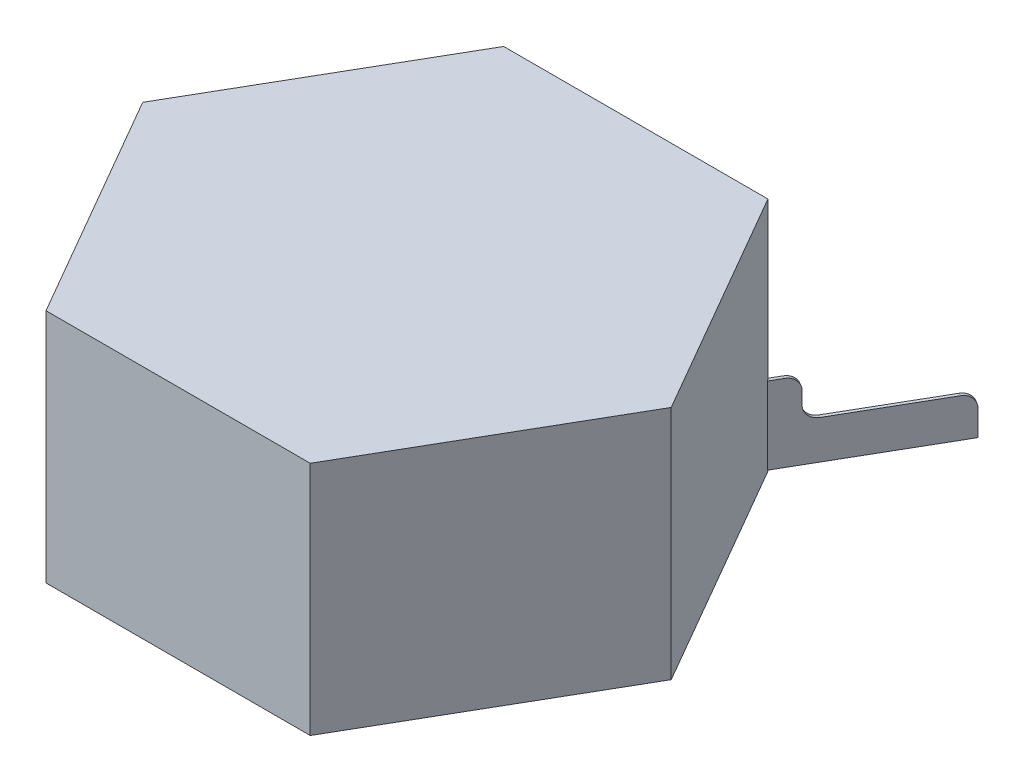
ISO-10303-21;
HEADER;
FILE_DESCRIPTION(('STEP AP214'),'2;1');
FILE_NAME('part.step','',(''),(''),'','','');
FILE_SCHEMA(('AUTOMOTIVE_DESIGN { 1 0 10303 214 1 1 1 1 }'));
ENDSEC;
DATA;
#1=APPLICATION_CONTEXT('core data for automotive mechanical design processes');
#2=APPLICATION_PROTOCOL_DEFINITION('international standard','automotive_design',2000,#1);
#3=PRODUCT_CONTEXT('',#1,'mechanical');
#4=PRODUCT('Part','Part','',(#3));
#5=PRODUCT_RELATED_PRODUCT_CATEGORY('part','',(#4));
#6=PRODUCT_DEFINITION_FORMATION('','',#4);
#7=PRODUCT_DEFINITION_CONTEXT('part definition',#1,'design');
#8=PRODUCT_DEFINITION('design','',#6,#7);
#9=PRODUCT_DEFINITION_SHAPE('','',#8);
#10=(LENGTH_UNIT() NAMED_UNIT(*) SI_UNIT(.MILLI.,.METRE.));
#11=(NAMED_UNIT(*) PLANE_ANGLE_UNIT() SI_UNIT($,.RADIAN.));
#12=(NAMED_UNIT(*) SI_UNIT($,.STERADIAN.) SOLID_ANGLE_UNIT());
#13=UNCERTAINTY_MEASURE_WITH_UNIT(LENGTH_MEASURE(1.E-05),#10,'distance_accuracy_value','');
#14=(GEOMETRIC_REPRESENTATION_CONTEXT(3) GLOBAL_UNCERTAINTY_ASSIGNED_CONTEXT((#13)) GLOBAL_UNIT_ASSIGNED_CONTEXT((#10,
#11,#12)) REPRESENTATION_CONTEXT('',''));
#15=CARTESIAN_POINT('',(0.,0.,0.));
#16=DIRECTION('',(0.,0.,1.));
#17=DIRECTION('',(1.,0.,0.));
#18=AXIS2_PLACEMENT_3D('',#15,#16,#17);
#19=CARTESIAN_POINT('',(3331.73389653825,3694.9589015043,-4489.43788317152));
#20=DIRECTION('',(-0.866025403784429,0.,-0.500000000000017));
#21=DIRECTION('',(-0.500000000000017,0.,0.866025403784429));
#22=AXIS2_PLACEMENT_3D('',#19,#20,#21);
#23=PLANE('',#22);
#24=DIRECTION('',(0.500000000000017,0.,-0.866025403784429));
#25=VECTOR('',#24,1.);
#26=CARTESIAN_POINT('',(3331.73389653825,936.624999999999,-4489.43788317152));
#27=LINE('',#26,#25);
#28=CARTESIAN_POINT('',(2810.4577868055,936.624999999999,-3586.5611763426));
#29=VERTEX_POINT('',#28);
#30=CARTESIAN_POINT('',(3331.73389653825,936.625,-4489.43788317152));
#31=VERTEX_POINT('',#30);
#32=EDGE_CURVE('E694',#29,#31,#27,.T.);
#33=ORIENTED_EDGE('',*,*,#32,.F.);
#34=DIRECTION('',(0.,-1.,0.));
#35=VECTOR('',#34,1.);
#36=CARTESIAN_POINT('',(2810.4577868055,3694.9589015043,-3586.5611763426));
#37=LINE('',#36,#35);
#38=CARTESIAN_POINT('',(2810.4577868055,6.35,-3586.5611763426));
#39=VERTEX_POINT('',#38);
#40=EDGE_CURVE('E368',#29,#39,#37,.T.);
#41=ORIENTED_EDGE('',*,*,#40,.T.);
#42=DIRECTION('',(0.500000000000017,0.,-0.866025403784429));
#43=VECTOR('',#42,1.);
#44=CARTESIAN_POINT('',(3331.73389653825,6.35,-4489.43788317152));
#45=LINE('',#44,#43);
#46=CARTESIAN_POINT('',(3331.73389653825,6.35,-4489.43788317152));
#47=VERTEX_POINT('',#46);
#48=EDGE_CURVE('E370',#39,#47,#45,.T.);
#49=ORIENTED_EDGE('',*,*,#48,.T.);
#50=DIRECTION('',(0.,-1.,0.));
#51=VECTOR('',#50,1.);
#52=CARTESIAN_POINT('',(3331.73389653825,3694.9589015043,-4489.43788317152));
#53=LINE('',#52,#51);
#54=EDGE_CURVE('E352',#31,#47,#53,.T.);
#55=ORIENTED_EDGE('',*,*,#54,.F.);
#56=EDGE_LOOP('',(#33,#41,#49,#55));
#57=FACE_BOUND('',#56,.T.);
#58=ADVANCED_FACE('F33',(#57),#23,.F.);
#59=CARTESIAN_POINT('',(2810.45778680547,3694.9589015043,-5392.31459000051));
#60=DIRECTION('',(-0.866025403784429,0.,0.500000000000017));
#61=DIRECTION('',(0.500000000000017,0.,0.866025403784429));
#62=AXIS2_PLACEMENT_3D('',#59,#60,#61);
#63=PLANE('',#62);
#64=DIRECTION('',(0.,-1.,0.));
#65=VECTOR('',#64,1.);
#66=CARTESIAN_POINT('',(2814.12396101472,3694.9589015043,-5385.96459000068));
#67=LINE('',#66,#65);
#68=CARTESIAN_POINT('',(2814.12396101472,319.778379999999,-5385.96459000068));
#69=VERTEX_POINT('',#68);
#70=CARTESIAN_POINT('',(2814.12396101472,14.9783799999996,-5385.96459000068));
#71=VERTEX_POINT('',#70);
#72=EDGE_CURVE('E340',#69,#71,#67,.T.);
#73=ORIENTED_EDGE('',*,*,#72,.F.);
#74=DIRECTION('',(-0.500000000000017,0.,-0.866025403784429));
#75=VECTOR('',#74,1.);
#76=CARTESIAN_POINT('',(2810.45778680547,319.778379999999,-5392.3145900005));
#77=LINE('',#76,#75);
#78=CARTESIAN_POINT('',(2810.45778680547,319.778379999999,-5392.31459000051));
#79=VERTEX_POINT('',#78);
#80=EDGE_CURVE('E279',#69,#79,#77,.T.);
#81=ORIENTED_EDGE('',*,*,#80,.T.);
#82=DIRECTION('',(0.,-1.,0.));
#83=VECTOR('',#82,1.);
#84=CARTESIAN_POINT('',(2810.45778680547,3694.9589015043,-5392.31459000051));
#85=LINE('',#84,#83);
#86=CARTESIAN_POINT('',(2810.45778680547,936.624999999999,-5392.31459000051));
#87=VERTEX_POINT('',#86);
#88=EDGE_CURVE('E348',#87,#79,#85,.T.);
#89=ORIENTED_EDGE('',*,*,#88,.F.);
#90=DIRECTION('',(-0.500000000000017,0.,-0.866025403784429));
#91=VECTOR('',#90,1.);
#92=CARTESIAN_POINT('',(2810.45778680547,936.625,-5392.31459000051));
#93=LINE('',#92,#91);
#94=EDGE_CURVE('E696',#31,#87,#93,.T.);
#95=ORIENTED_EDGE('',*,*,#94,.F.);
#96=ORIENTED_EDGE('',*,*,#54,.T.);
#97=DIRECTION('',(-0.500000000000017,0.,-0.866025403784429));
#98=VECTOR('',#97,1.);
#99=CARTESIAN_POINT('',(2810.45778680547,6.35,-5392.31459000051));
#100=LINE('',#99,#98);
#101=CARTESIAN_POINT('',(2810.45778680547,6.35,-5392.31459000051));
#102=VERTEX_POINT('',#101);
#103=EDGE_CURVE('E344',#47,#102,#100,.T.);
#104=ORIENTED_EDGE('',*,*,#103,.T.);
#105=CARTESIAN_POINT('',(2810.45778680547,14.9783799999997,-5392.31459000051));
#106=VERTEX_POINT('',#105);
#107=EDGE_CURVE('E342',#106,#102,#85,.T.);
#108=ORIENTED_EDGE('',*,*,#107,.F.);
#109=DIRECTION('',(0.500000000000017,0.,0.866025403784429));
#110=VECTOR('',#109,1.);
#111=CARTESIAN_POINT('',(2810.45778680547,14.9783799999996,-5392.31459000051));
#112=LINE('',#111,#110);
#113=EDGE_CURVE('E276',#106,#71,#112,.T.);
#114=ORIENTED_EDGE('',*,*,#113,.T.);
#115=EDGE_LOOP('',(#73,#81,#89,#95,#96,#104,#108,#114));
#116=FACE_BOUND('',#115,.T.);
#117=ADVANCED_FACE('F338',(#116),#63,.F.);
#118=CARTESIAN_POINT('',(1767.90556733976,3694.9589015043,-5392.31459000051));
#119=DIRECTION('',(0.,0.,1.));
#120=DIRECTION('',(1.,0.,0.));
#121=AXIS2_PLACEMENT_3D('',#118,#119,#120);
#122=PLANE('',#121);
#123=DIRECTION('',(0.,-1.,0.));
#124=VECTOR('',#123,1.);
#125=CARTESIAN_POINT('',(1775.2379157586,3694.9589015043,-5392.31459000051));
#126=LINE('',#125,#124);
#127=CARTESIAN_POINT('',(1775.2379157586,319.778379999999,-5392.31459000051));
#128=VERTEX_POINT('',#127);
#129=CARTESIAN_POINT('',(1775.2379157586,14.9783799999991,-5392.31459000051));
#130=VERTEX_POINT('',#129);
#131=EDGE_CURVE('E11',#128,#130,#126,.T.);
#132=ORIENTED_EDGE('',*,*,#131,.F.);
#133=DIRECTION('',(-1.,0.,0.));
#134=VECTOR('',#133,1.);
#135=CARTESIAN_POINT('',(1767.90556733976,319.778379999999,-5392.31459000051));
#136=LINE('',#135,#134);
#137=CARTESIAN_POINT('',(1767.90556733976,319.778379999999,-5392.31459000051));
#138=VERTEX_POINT('',#137);
#139=EDGE_CURVE('E260',#128,#138,#136,.T.);
#140=ORIENTED_EDGE('',*,*,#139,.T.);
#141=DIRECTION('',(0.,-1.,0.));
#142=VECTOR('',#141,1.);
#143=CARTESIAN_POINT('',(1767.90556733976,3694.9589015043,-5392.31459000051));
#144=LINE('',#143,#142);
#145=CARTESIAN_POINT('',(1767.90556733976,936.624999999999,-5392.31459000051));
#146=VERTEX_POINT('',#145);
#147=EDGE_CURVE('E357',#146,#138,#144,.T.);
#148=ORIENTED_EDGE('',*,*,#147,.F.);
#149=DIRECTION('',(-1.,0.,0.));
#150=VECTOR('',#149,1.);
#151=CARTESIAN_POINT('',(1767.90556733976,936.624999999999,-5392.31459000051));
#152=LINE('',#151,#150);
#153=EDGE_CURVE('E701',#87,#146,#152,.T.);
#154=ORIENTED_EDGE('',*,*,#153,.F.);
#155=ORIENTED_EDGE('',*,*,#88,.T.);
#156=DIRECTION('',(-1.,0.,0.));
#157=VECTOR('',#156,1.);
#158=CARTESIAN_POINT('',(1767.90556733975,319.77838,-5392.31459000051));
#159=LINE('',#158,#157);
#160=CARTESIAN_POINT('',(2803.12543838656,319.77838,-5392.31459000051));
#161=VERTEX_POINT('',#160);
#162=EDGE_CURVE('E377',#79,#161,#159,.T.);
#163=ORIENTED_EDGE('',*,*,#162,.T.);
#164=DIRECTION('',(0.,-1.,0.));
#165=VECTOR('',#164,1.);
#166=CARTESIAN_POINT('',(2803.12543838656,3694.9589015043,-5392.31459000051));
#167=LINE('',#166,#165);
#168=CARTESIAN_POINT('',(2803.12543838656,14.9783799999996,-5392.31459000051));
#169=VERTEX_POINT('',#168);
#170=EDGE_CURVE('E371',#161,#169,#167,.T.);
#171=ORIENTED_EDGE('',*,*,#170,.T.);
#172=DIRECTION('',(1.,0.,0.));
#173=VECTOR('',#172,1.);
#174=CARTESIAN_POINT('',(1767.90556733976,14.9783799999992,-5392.31459000051));
#175=LINE('',#174,#173);
#176=EDGE_CURVE('E374',#169,#106,#175,.T.);
#177=ORIENTED_EDGE('',*,*,#176,.T.);
#178=ORIENTED_EDGE('',*,*,#107,.T.);
#179=DIRECTION('',(-1.,0.,0.));
#180=VECTOR('',#179,1.);
#181=CARTESIAN_POINT('',(1767.90556733976,6.35,-5392.31459000051));
#182=LINE('',#181,#180);
#183=CARTESIAN_POINT('',(1767.90556733976,6.35,-5392.31459000051));
#184=VERTEX_POINT('',#183);
#185=EDGE_CURVE('E351',#102,#184,#182,.T.);
#186=ORIENTED_EDGE('',*,*,#185,.T.);
#187=CARTESIAN_POINT('',(1767.90556733976,14.9783799999989,-5392.31459000051));
#188=VERTEX_POINT('',#187);
#189=EDGE_CURVE('E361',#188,#184,#144,.T.);
#190=ORIENTED_EDGE('',*,*,#189,.F.);
#191=DIRECTION('',(1.,0.,0.));
#192=VECTOR('',#191,1.);
#193=CARTESIAN_POINT('',(1767.90556733976,14.9783799999992,-5392.31459000051));
#194=LINE('',#193,#192);
#195=EDGE_CURVE('E258',#188,#130,#194,.T.);
#196=ORIENTED_EDGE('',*,*,#195,.T.);
#197=EDGE_LOOP('',(#132,#140,#148,#154,#155,#163,#171,#177,#178,#186,#190,#196));
#198=FACE_BOUND('',#197,.T.);
#199=ADVANCED_FACE('F396',(#198),#122,.F.);
#200=CARTESIAN_POINT('',(1246.62945760701,3694.9589015043,-4489.43788317159));
#201=DIRECTION('',(0.866025403784429,0.,0.500000000000017));
#202=DIRECTION('',(0.500000000000017,0.,-0.866025403784429));
#203=AXIS2_PLACEMENT_3D('',#200,#201,#202);
#204=PLANE('',#203);
#205=ORIENTED_EDGE('',*,*,#147,.T.);
#206=DIRECTION('',(-0.500000000000017,0.,0.866025403784429));
#207=VECTOR('',#206,1.);
#208=CARTESIAN_POINT('',(1246.62945760701,319.778379999998,-4489.43788317159));
#209=LINE('',#208,#207);
#210=CARTESIAN_POINT('',(1764.23939313047,319.778379999999,-5385.96459000063));
#211=VERTEX_POINT('',#210);
#212=EDGE_CURVE('E41',#138,#211,#209,.T.);
#213=ORIENTED_EDGE('',*,*,#212,.T.);
#214=DIRECTION('',(0.,-1.,0.));
#215=VECTOR('',#214,1.);
#216=CARTESIAN_POINT('',(1764.23939313047,3694.9589015043,-5385.96459000062));
#217=LINE('',#216,#215);
#218=CARTESIAN_POINT('',(1764.23939313047,14.9783799999992,-5385.96459000063));
#219=VERTEX_POINT('',#218);
#220=EDGE_CURVE('E381',#211,#219,#217,.T.);
#221=ORIENTED_EDGE('',*,*,#220,.T.);
#222=DIRECTION('',(0.500000000000017,0.,-0.866025403784429));
#223=VECTOR('',#222,1.);
#224=CARTESIAN_POINT('',(1246.62945760701,14.9783799999983,-4489.43788317159));
#225=LINE('',#224,#223);
#226=EDGE_CURVE('E384',#219,#188,#225,.T.);
#227=ORIENTED_EDGE('',*,*,#226,.T.);
#228=ORIENTED_EDGE('',*,*,#189,.T.);
#229=DIRECTION('',(-0.500000000000017,0.,0.866025403784429));
#230=VECTOR('',#229,1.);
#231=CARTESIAN_POINT('',(1246.62945760701,6.35,-4489.43788317159));
#232=LINE('',#231,#230);
#233=CARTESIAN_POINT('',(1246.62945760701,6.35,-4489.43788317159));
#234=VERTEX_POINT('',#233);
#235=EDGE_CURVE('E360',#184,#234,#232,.T.);
#236=ORIENTED_EDGE('',*,*,#235,.T.);
#237=DIRECTION('',(0.,-1.,0.));
#238=VECTOR('',#237,1.);
#239=CARTESIAN_POINT('',(1246.62945760701,3694.9589015043,-4489.43788317159));
#240=LINE('',#239,#238);
#241=CARTESIAN_POINT('',(1246.62945760701,936.624999999998,-4489.43788317159));
#242=VERTEX_POINT('',#241);
#243=EDGE_CURVE('E362',#242,#234,#240,.T.);
#244=ORIENTED_EDGE('',*,*,#243,.F.);
#245=DIRECTION('',(-0.500000000000017,0.,0.866025403784429));
#246=VECTOR('',#245,1.);
#247=CARTESIAN_POINT('',(1246.62945760701,936.624999999999,-4489.43788317159));
#248=LINE('',#247,#246);
#249=EDGE_CURVE('E703',#146,#242,#248,.T.);
#250=ORIENTED_EDGE('',*,*,#249,.F.);
#251=EDGE_LOOP('',(#205,#213,#221,#227,#228,#236,#244,#250));
#252=FACE_BOUND('',#251,.T.);
#253=ADVANCED_FACE('F388',(#252),#204,.F.);
#254=CARTESIAN_POINT('',(1767.90556733979,3694.9589015043,-3586.5611763426));
#255=DIRECTION('',(0.866025403784429,0.,-0.500000000000016));
#256=DIRECTION('',(-0.500000000000017,0.,-0.866025403784429));
#257=AXIS2_PLACEMENT_3D('',#254,#255,#256);
#258=PLANE('',#257);
#259=DIRECTION('',(0.500000000000017,0.,0.866025403784429));
#260=VECTOR('',#259,1.);
#261=CARTESIAN_POINT('',(1767.90556733979,936.624999999998,-3586.5611763426));
#262=LINE('',#261,#260);
#263=CARTESIAN_POINT('',(1767.90556733979,936.624999999998,-3586.5611763426));
#264=VERTEX_POINT('',#263);
#265=EDGE_CURVE('E375',#242,#264,#262,.T.);
#266=ORIENTED_EDGE('',*,*,#265,.F.);
#267=ORIENTED_EDGE('',*,*,#243,.T.);
#268=DIRECTION('',(0.500000000000016,0.,0.866025403784429));
#269=VECTOR('',#268,1.);
#270=CARTESIAN_POINT('',(1767.90556733979,6.35,-3586.5611763426));
#271=LINE('',#270,#269);
#272=CARTESIAN_POINT('',(1767.90556733979,6.35,-3586.5611763426));
#273=VERTEX_POINT('',#272);
#274=EDGE_CURVE('E364',#234,#273,#271,.T.);
#275=ORIENTED_EDGE('',*,*,#274,.T.);
#276=DIRECTION('',(0.,-1.,0.));
#277=VECTOR('',#276,1.);
#278=CARTESIAN_POINT('',(1767.90556733979,3694.9589015043,-3586.5611763426));
#279=LINE('',#278,#277);
#280=EDGE_CURVE('E365',#264,#273,#279,.T.);
#281=ORIENTED_EDGE('',*,*,#280,.F.);
#282=EDGE_LOOP('',(#266,#267,#275,#281));
#283=FACE_BOUND('',#282,.T.);
#284=ADVANCED_FACE('F464',(#283),#258,.F.);
#285=CARTESIAN_POINT('',(1767.90556733979,3694.9589015043,-3586.5611763426));
#286=DIRECTION('',(0.,0.,-1.));
#287=DIRECTION('',(-1.,0.,0.));
#288=AXIS2_PLACEMENT_3D('',#285,#286,#287);
#289=PLANE('',#288);
#290=DIRECTION('',(1.,0.,0.));
#291=VECTOR('',#290,1.);
#292=CARTESIAN_POINT('',(1767.9055673398,936.624999999998,-3586.5611763426));
#293=LINE('',#292,#291);
#294=EDGE_CURVE('E692',#264,#29,#293,.T.);
#295=ORIENTED_EDGE('',*,*,#294,.F.);
#296=ORIENTED_EDGE('',*,*,#280,.T.);
#297=DIRECTION('',(1.,0.,0.));
#298=VECTOR('',#297,1.);
#299=CARTESIAN_POINT('',(1767.90556733979,6.35,-3586.5611763426));
#300=LINE('',#299,#298);
#301=EDGE_CURVE('E367',#273,#39,#300,.T.);
#302=ORIENTED_EDGE('',*,*,#301,.T.);
#303=ORIENTED_EDGE('',*,*,#40,.F.);
#304=EDGE_LOOP('',(#295,#296,#302,#303));
#305=FACE_BOUND('',#304,.T.);
#306=ADVANCED_FACE('F467',(#305),#289,.F.);
#307=CARTESIAN_POINT('',(0.,6.35,0.));
#308=DIRECTION('',(0.,1.,0.));
#309=DIRECTION('',(0.,0.,1.));
#310=AXIS2_PLACEMENT_3D('',#307,#308,#309);
#311=PLANE('',#310);
#312=ORIENTED_EDGE('',*,*,#48,.F.);
#313=ORIENTED_EDGE('',*,*,#301,.F.);
#314=ORIENTED_EDGE('',*,*,#274,.F.);
#315=ORIENTED_EDGE('',*,*,#235,.F.);
#316=ORIENTED_EDGE('',*,*,#185,.F.);
#317=ORIENTED_EDGE('',*,*,#103,.F.);
#318=EDGE_LOOP('',(#312,#313,#314,#315,#316,#317));
#319=FACE_BOUND('',#318,.T.);
#320=ADVANCED_FACE('F471',(#319),#311,.F.);
#321=CARTESIAN_POINT('',(2289.18167707263,936.624999999999,-4489.43730000051));
#322=DIRECTION('',(0.,1.,0.));
#323=DIRECTION('',(0.,0.,-1.));
#324=AXIS2_PLACEMENT_3D('',#321,#322,#323);
#325=PLANE('',#324);
#326=ORIENTED_EDGE('',*,*,#294,.T.);
#327=ORIENTED_EDGE('',*,*,#32,.T.);
#328=ORIENTED_EDGE('',*,*,#94,.T.);
#329=ORIENTED_EDGE('',*,*,#153,.T.);
#330=ORIENTED_EDGE('',*,*,#249,.T.);
#331=ORIENTED_EDGE('',*,*,#265,.T.);
#332=EDGE_LOOP('',(#326,#327,#328,#329,#330,#331));
#333=FACE_BOUND('',#332,.T.);
#334=ADVANCED_FACE('F35',(#333),#325,.T.);
#335=CARTESIAN_POINT('',(2813.6664383866,14.9783799999995,-5385.17213756316));
#336=DIRECTION('',(-0.866025403784429,0.,-0.500000000000017));
#337=DIRECTION('',(-0.500000000000017,0.,0.866025403784429));
#338=AXIS2_PLACEMENT_3D('',#335,#336,#337);
#339=PLANE('',#338);
#340=DIRECTION('',(-0.500000000000017,0.,0.866025403784429));
#341=VECTOR('',#340,1.);
#342=CARTESIAN_POINT('',(2813.6664383866,319.77838,-5385.17213756316));
#343=LINE('',#342,#341);
#344=CARTESIAN_POINT('',(2839.0664383866,319.77838,-5429.16622807541));
#345=VERTEX_POINT('',#344);
#346=EDGE_CURVE('E280',#69,#345,#343,.F.);
#347=ORIENTED_EDGE('',*,*,#346,.F.);
#348=ORIENTED_EDGE('',*,*,#72,.T.);
#349=DIRECTION('',(-0.500000000000017,0.,0.866025403784429));
#350=VECTOR('',#349,1.);
#351=CARTESIAN_POINT('',(2813.6664383866,14.9783799999995,-5385.17213756316));
#352=LINE('',#351,#350);
#353=CARTESIAN_POINT('',(3118.46643838661,14.9783799999999,-5913.10122371015));
#354=VERTEX_POINT('',#353);
#355=EDGE_CURVE('E289',#354,#71,#352,.T.);
#356=ORIENTED_EDGE('',*,*,#355,.F.);
#357=DIRECTION('',(0.,1.,0.));
#358=VECTOR('',#357,1.);
#359=CARTESIAN_POINT('',(3118.46643838661,14.9783799999999,-5913.10122371015));
#360=LINE('',#359,#358);
#361=CARTESIAN_POINT('',(3118.46643838661,116.57838,-5913.10122371015));
#362=VERTEX_POINT('',#361);
#363=EDGE_CURVE('E268',#362,#354,#360,.F.);
#364=ORIENTED_EDGE('',*,*,#363,.F.);
#365=CARTESIAN_POINT('',(3093.06643838661,116.57838,-5869.1071331979));
#366=DIRECTION('',(0.866025403784429,0.,0.500000000000017));
#367=DIRECTION('',(0.500000000000017,0.,-0.866025403784429));
#368=AXIS2_PLACEMENT_3D('',#365,#366,#367);
#369=CIRCLE('',#368,50.8);
#370=CARTESIAN_POINT('',(3093.06643838661,167.37838,-5869.1071331979));
#371=VERTEX_POINT('',#370);
#372=EDGE_CURVE('E267',#371,#362,#369,.F.);
#373=ORIENTED_EDGE('',*,*,#372,.F.);
#374=DIRECTION('',(-0.500000000000017,0.,0.866025403784429));
#375=VECTOR('',#374,1.);
#376=CARTESIAN_POINT('',(2813.6664383866,167.37838,-5385.17213756316));
#377=LINE('',#376,#375);
#378=CARTESIAN_POINT('',(2889.86643838661,167.37838,-5517.15440909991));
#379=VERTEX_POINT('',#378);
#380=EDGE_CURVE('E298',#379,#371,#377,.F.);
#381=ORIENTED_EDGE('',*,*,#380,.F.);
#382=CARTESIAN_POINT('',(2889.8664383866,218.17838,-5517.15440909991));
#383=DIRECTION('',(-0.866025403784429,0.,-0.500000000000017));
#384=DIRECTION('',(-0.500000000000017,0.,0.866025403784429));
#385=AXIS2_PLACEMENT_3D('',#382,#383,#384);
#386=CIRCLE('',#385,50.8);
#387=CARTESIAN_POINT('',(2864.4664383866,218.17838,-5473.16031858766));
#388=VERTEX_POINT('',#387);
#389=EDGE_CURVE('E263',#388,#379,#386,.F.);
#390=ORIENTED_EDGE('',*,*,#389,.F.);
#391=DIRECTION('',(0.,1.,0.));
#392=VECTOR('',#391,1.);
#393=CARTESIAN_POINT('',(2864.4664383866,14.9783799999996,-5473.16031858766));
#394=LINE('',#393,#392);
#395=CARTESIAN_POINT('',(2864.4664383866,268.97838,-5473.16031858766));
#396=VERTEX_POINT('',#395);
#397=EDGE_CURVE('E294',#396,#388,#394,.F.);
#398=ORIENTED_EDGE('',*,*,#397,.F.);
#399=CARTESIAN_POINT('',(2839.0664383866,268.97838,-5429.16622807541));
#400=DIRECTION('',(0.866025403784429,0.,0.500000000000017));
#401=DIRECTION('',(0.500000000000017,0.,-0.866025403784429));
#402=AXIS2_PLACEMENT_3D('',#399,#400,#401);
#403=CIRCLE('',#402,50.8);
#404=EDGE_CURVE('E291',#345,#396,#403,.F.);
#405=ORIENTED_EDGE('',*,*,#404,.F.);
#406=EDGE_LOOP('',(#347,#348,#356,#364,#373,#381,#390,#398,#405));
#407=FACE_BOUND('',#406,.T.);
#408=ADVANCED_FACE('F476',(#407),#339,.F.);
#409=CARTESIAN_POINT('',(3403.90910034861,319.77838,-5044.39537779218));
#410=DIRECTION('',(0.,1.,0.));
#411=DIRECTION('',(0.,0.,1.));
#412=AXIS2_PLACEMENT_3D('',#409,#410,#411);
#413=PLANE('',#412);
#414=ORIENTED_EDGE('',*,*,#80,.F.);
#415=ORIENTED_EDGE('',*,*,#346,.T.);
#416=DIRECTION('',(-0.866025403784429,0.,-0.500000000000017));
#417=VECTOR('',#416,1.);
#418=CARTESIAN_POINT('',(3429.30910034861,319.77838,-5088.38946830443));
#419=LINE('',#418,#417);
#420=CARTESIAN_POINT('',(2828.06791575854,319.778379999999,-5435.51622807541));
#421=VERTEX_POINT('',#420);
#422=EDGE_CURVE('E283',#345,#421,#419,.T.);
#423=ORIENTED_EDGE('',*,*,#422,.T.);
#424=DIRECTION('',(0.500000000000016,0.,-0.866025403784429));
#425=VECTOR('',#424,1.);
#426=CARTESIAN_POINT('',(2802.66791575854,319.77838,-5391.52213756316));
#427=LINE('',#426,#425);
#428=EDGE_CURVE('E731',#161,#421,#427,.T.);
#429=ORIENTED_EDGE('',*,*,#428,.F.);
#430=ORIENTED_EDGE('',*,*,#162,.F.);
#431=EDGE_LOOP('',(#414,#415,#423,#429,#430));
#432=FACE_BOUND('',#431,.T.);
#433=ADVANCED_FACE('F479',(#432),#413,.T.);
#434=CARTESIAN_POINT('',(3708.70910034862,14.97838,-5572.32446393917));
#435=DIRECTION('',(0.,-1.,0.));
#436=DIRECTION('',(1.,0.,0.));
#437=AXIS2_PLACEMENT_3D('',#434,#435,#436);
#438=PLANE('',#437);
#439=ORIENTED_EDGE('',*,*,#113,.F.);
#440=ORIENTED_EDGE('',*,*,#176,.F.);
#441=DIRECTION('',(-0.500000000000018,0.,0.866025403784428));
#442=VECTOR('',#441,1.);
#443=CARTESIAN_POINT('',(3107.46791575855,14.9783799999999,-5919.45122371015));
#444=LINE('',#443,#442);
#445=CARTESIAN_POINT('',(3107.46791575855,14.9783799999999,-5919.45122371015));
#446=VERTEX_POINT('',#445);
#447=EDGE_CURVE('E56',#446,#169,#444,.T.);
#448=ORIENTED_EDGE('',*,*,#447,.F.);
#449=DIRECTION('',(-0.866025403784429,0.,-0.500000000000017));
#450=VECTOR('',#449,1.);
#451=CARTESIAN_POINT('',(3708.70910034862,14.97838,-5572.32446393917));
#452=LINE('',#451,#450);
#453=EDGE_CURVE('E264',#354,#446,#452,.T.);
#454=ORIENTED_EDGE('',*,*,#453,.F.);
#455=ORIENTED_EDGE('',*,*,#355,.T.);
#456=EDGE_LOOP('',(#439,#440,#448,#454,#455));
#457=FACE_BOUND('',#456,.T.);
#458=ADVANCED_FACE('F332',(#457),#438,.T.);
#459=CARTESIAN_POINT('',(2878.86791575854,218.17838,-5523.50440909991));
#460=DIRECTION('',(-0.866025403784429,0.,-0.500000000000017));
#461=DIRECTION('',(-0.500000000000017,0.,0.866025403784429));
#462=AXIS2_PLACEMENT_3D('',#459,#460,#461);
#463=PLANE('',#462);
#464=ORIENTED_EDGE('',*,*,#170,.F.);
#465=ORIENTED_EDGE('',*,*,#428,.T.);
#466=CARTESIAN_POINT('',(2828.06791575854,268.97838,-5435.51622807541));
#467=DIRECTION('',(-0.866025403784429,0.,-0.500000000000017));
#468=DIRECTION('',(-0.500000000000017,0.,0.866025403784429));
#469=AXIS2_PLACEMENT_3D('',#466,#467,#468);
#470=CIRCLE('',#469,50.7999999999995);
#471=CARTESIAN_POINT('',(2853.46791575854,268.97838,-5479.51031858766));
#472=VERTEX_POINT('',#471);
#473=EDGE_CURVE('E730',#421,#472,#470,.T.);
#474=ORIENTED_EDGE('',*,*,#473,.T.);
#475=DIRECTION('',(0.,-1.,0.));
#476=VECTOR('',#475,1.);
#477=CARTESIAN_POINT('',(2853.46791575854,268.97838,-5479.51031858766));
#478=LINE('',#477,#476);
#479=CARTESIAN_POINT('',(2853.46791575854,218.17838,-5479.51031858766));
#480=VERTEX_POINT('',#479);
#481=EDGE_CURVE('E269',#472,#480,#478,.T.);
#482=ORIENTED_EDGE('',*,*,#481,.T.);
#483=CARTESIAN_POINT('',(2878.86791575854,218.17838,-5523.50440909991));
#484=DIRECTION('',(0.866025403784429,0.,0.500000000000017));
#485=DIRECTION('',(-0.500000000000017,0.,0.866025403784429));
#486=AXIS2_PLACEMENT_3D('',#483,#484,#485);
#487=CIRCLE('',#486,50.8000000000006);
#488=CARTESIAN_POINT('',(2878.86791575854,167.378379999999,-5523.50440909991));
#489=VERTEX_POINT('',#488);
#490=EDGE_CURVE('E307',#480,#489,#487,.T.);
#491=ORIENTED_EDGE('',*,*,#490,.T.);
#492=DIRECTION('',(0.500000000000017,0.,-0.866025403784429));
#493=VECTOR('',#492,1.);
#494=CARTESIAN_POINT('',(2878.86791575854,167.378379999999,-5523.50440909991));
#495=LINE('',#494,#493);
#496=CARTESIAN_POINT('',(3082.06791575855,167.37838,-5875.4571331979));
#497=VERTEX_POINT('',#496);
#498=EDGE_CURVE('E312',#489,#497,#495,.T.);
#499=ORIENTED_EDGE('',*,*,#498,.T.);
#500=CARTESIAN_POINT('',(3082.06791575855,116.57838,-5875.4571331979));
#501=DIRECTION('',(-0.866025403784429,0.,-0.500000000000017));
#502=DIRECTION('',(-0.500000000000017,0.,0.866025403784429));
#503=AXIS2_PLACEMENT_3D('',#500,#501,#502);
#504=CIRCLE('',#503,50.8000000000002);
#505=CARTESIAN_POINT('',(3107.46791575855,116.57838,-5919.45122371015));
#506=VERTEX_POINT('',#505);
#507=EDGE_CURVE('E317',#497,#506,#504,.T.);
#508=ORIENTED_EDGE('',*,*,#507,.T.);
#509=DIRECTION('',(0.,-1.,0.));
#510=VECTOR('',#509,1.);
#511=CARTESIAN_POINT('',(3107.46791575855,116.57838,-5919.45122371015));
#512=LINE('',#511,#510);
#513=EDGE_CURVE('E735',#506,#446,#512,.T.);
#514=ORIENTED_EDGE('',*,*,#513,.T.);
#515=ORIENTED_EDGE('',*,*,#447,.T.);
#516=EDGE_LOOP('',(#464,#465,#474,#482,#491,#499,#508,#514,#515));
#517=FACE_BOUND('',#516,.T.);
#518=ADVANCED_FACE('F484',(#517),#463,.T.);
#519=CARTESIAN_POINT('',(3480.10910034861,218.17838,-5176.37764932893));
#520=DIRECTION('',(-0.866025403784429,0.,-0.500000000000017));
#521=DIRECTION('',(-0.500000000000017,0.,0.866025403784429));
#522=AXIS2_PLACEMENT_3D('',#519,#520,#521);
#523=CYLINDRICAL_SURFACE('',#522,50.8000000000006);
#524=ORIENTED_EDGE('',*,*,#389,.T.);
#525=DIRECTION('',(-0.866025403784429,0.,-0.500000000000017));
#526=VECTOR('',#525,1.);
#527=CARTESIAN_POINT('',(3480.10910034861,167.378379999999,-5176.37764932893));
#528=LINE('',#527,#526);
#529=EDGE_CURVE('E274',#379,#489,#528,.T.);
#530=ORIENTED_EDGE('',*,*,#529,.T.);
#531=ORIENTED_EDGE('',*,*,#490,.F.);
#532=DIRECTION('',(-0.866025403784429,0.,-0.500000000000017));
#533=VECTOR('',#532,1.);
#534=CARTESIAN_POINT('',(3454.70910034861,218.17838,-5132.38355881668));
#535=LINE('',#534,#533);
#536=EDGE_CURVE('E293',#388,#480,#535,.T.);
#537=ORIENTED_EDGE('',*,*,#536,.F.);
#538=EDGE_LOOP('',(#524,#530,#531,#537));
#539=FACE_BOUND('',#538,.T.);
#540=ADVANCED_FACE('F480',(#539),#523,.F.);
#541=CARTESIAN_POINT('',(3454.70910034861,268.97838,-5132.38355881668));
#542=DIRECTION('',(0.500000000000017,0.,-0.866025403784429));
#543=DIRECTION('',(-0.866025403784429,0.,-0.500000000000017));
#544=AXIS2_PLACEMENT_3D('',#541,#542,#543);
#545=PLANE('',#544);
#546=ORIENTED_EDGE('',*,*,#397,.T.);
#547=ORIENTED_EDGE('',*,*,#536,.T.);
#548=ORIENTED_EDGE('',*,*,#481,.F.);
#549=DIRECTION('',(-0.866025403784429,0.,-0.500000000000017));
#550=VECTOR('',#549,1.);
#551=CARTESIAN_POINT('',(3454.70910034861,268.97838,-5132.38355881668));
#552=LINE('',#551,#550);
#553=EDGE_CURVE('E284',#396,#472,#552,.T.);
#554=ORIENTED_EDGE('',*,*,#553,.F.);
#555=EDGE_LOOP('',(#546,#547,#548,#554));
#556=FACE_BOUND('',#555,.T.);
#557=ADVANCED_FACE('F483',(#556),#545,.T.);
#558=CARTESIAN_POINT('',(3429.30910034861,268.97838,-5088.38946830443));
#559=DIRECTION('',(-0.866025403784429,0.,-0.500000000000017));
#560=DIRECTION('',(-0.500000000000017,0.,0.866025403784429));
#561=AXIS2_PLACEMENT_3D('',#558,#559,#560);
#562=CYLINDRICAL_SURFACE('',#561,50.7999999999995);
#563=ORIENTED_EDGE('',*,*,#404,.T.);
#564=ORIENTED_EDGE('',*,*,#553,.T.);
#565=ORIENTED_EDGE('',*,*,#473,.F.);
#566=ORIENTED_EDGE('',*,*,#422,.F.);
#567=EDGE_LOOP('',(#563,#564,#565,#566));
#568=FACE_BOUND('',#567,.T.);
#569=ADVANCED_FACE('F488',(#568),#562,.T.);
#570=CARTESIAN_POINT('',(3708.70910034862,116.57838,-5572.32446393917));
#571=DIRECTION('',(0.500000000000017,0.,-0.866025403784429));
#572=DIRECTION('',(-0.866025403784429,0.,-0.500000000000017));
#573=AXIS2_PLACEMENT_3D('',#570,#571,#572);
#574=PLANE('',#573);
#575=ORIENTED_EDGE('',*,*,#363,.T.);
#576=ORIENTED_EDGE('',*,*,#453,.T.);
#577=ORIENTED_EDGE('',*,*,#513,.F.);
#578=DIRECTION('',(-0.866025403784429,0.,-0.500000000000017));
#579=VECTOR('',#578,1.);
#580=CARTESIAN_POINT('',(3708.70910034862,116.57838,-5572.32446393917));
#581=LINE('',#580,#579);
#582=EDGE_CURVE('E302',#362,#506,#581,.T.);
#583=ORIENTED_EDGE('',*,*,#582,.F.);
#584=EDGE_LOOP('',(#575,#576,#577,#583));
#585=FACE_BOUND('',#584,.T.);
#586=ADVANCED_FACE('F492',(#585),#574,.T.);
#587=CARTESIAN_POINT('',(3683.30910034862,116.57838,-5528.33037342692));
#588=DIRECTION('',(-0.866025403784429,0.,-0.500000000000017));
#589=DIRECTION('',(-0.500000000000017,0.,0.866025403784429));
#590=AXIS2_PLACEMENT_3D('',#587,#588,#589);
#591=CYLINDRICAL_SURFACE('',#590,50.8000000000002);
#592=ORIENTED_EDGE('',*,*,#372,.T.);
#593=ORIENTED_EDGE('',*,*,#582,.T.);
#594=ORIENTED_EDGE('',*,*,#507,.F.);
#595=DIRECTION('',(-0.866025403784429,0.,-0.500000000000017));
#596=VECTOR('',#595,1.);
#597=CARTESIAN_POINT('',(3683.30910034862,167.37838,-5528.33037342692));
#598=LINE('',#597,#596);
#599=EDGE_CURVE('E301',#371,#497,#598,.T.);
#600=ORIENTED_EDGE('',*,*,#599,.F.);
#601=EDGE_LOOP('',(#592,#593,#594,#600));
#602=FACE_BOUND('',#601,.T.);
#603=ADVANCED_FACE('F501',(#602),#591,.T.);
#604=CARTESIAN_POINT('',(3480.10910034861,167.378379999999,-5176.37764932893));
#605=DIRECTION('',(0.,1.,0.));
#606=DIRECTION('',(0.,0.,1.));
#607=AXIS2_PLACEMENT_3D('',#604,#605,#606);
#608=PLANE('',#607);
#609=ORIENTED_EDGE('',*,*,#380,.T.);
#610=ORIENTED_EDGE('',*,*,#599,.T.);
#611=ORIENTED_EDGE('',*,*,#498,.F.);
#612=ORIENTED_EDGE('',*,*,#529,.F.);
#613=EDGE_LOOP('',(#609,#610,#611,#612));
#614=FACE_BOUND('',#613,.T.);
#615=ADVANCED_FACE('F504',(#614),#608,.T.);
#616=CARTESIAN_POINT('',(1775.69543838662,14.978379999999,-5391.52213756316));
#617=DIRECTION('',(-0.866025403784429,0.,0.500000000000017));
#618=DIRECTION('',(0.500000000000017,0.,0.866025403784429));
#619=AXIS2_PLACEMENT_3D('',#616,#617,#618);
#620=PLANE('',#619);
#621=DIRECTION('',(0.500000000000017,0.,0.866025403784429));
#622=VECTOR('',#621,1.);
#623=CARTESIAN_POINT('',(1775.69543838662,319.778379999999,-5391.52213756316));
#624=LINE('',#623,#622);
#625=CARTESIAN_POINT('',(1750.29543838662,319.778379999999,-5435.51622807541));
#626=VERTEX_POINT('',#625);
#627=EDGE_CURVE('E254',#128,#626,#624,.F.);
#628=ORIENTED_EDGE('',*,*,#627,.F.);
#629=ORIENTED_EDGE('',*,*,#131,.T.);
#630=DIRECTION('',(0.500000000000017,0.,0.866025403784429));
#631=VECTOR('',#630,1.);
#632=CARTESIAN_POINT('',(1775.69543838662,14.978379999999,-5391.52213756316));
#633=LINE('',#632,#631);
#634=CARTESIAN_POINT('',(1470.89543838661,14.9783799999991,-5919.45122371015));
#635=VERTEX_POINT('',#634);
#636=EDGE_CURVE('E243',#635,#130,#633,.T.);
#637=ORIENTED_EDGE('',*,*,#636,.F.);
#638=DIRECTION('',(0.,1.,0.));
#639=VECTOR('',#638,1.);
#640=CARTESIAN_POINT('',(1470.89543838661,14.9783799999991,-5919.45122371015));
#641=LINE('',#640,#639);
#642=CARTESIAN_POINT('',(1470.89543838661,116.578379999999,-5919.45122371015));
#643=VERTEX_POINT('',#642);
#644=EDGE_CURVE('E232',#643,#635,#641,.F.);
#645=ORIENTED_EDGE('',*,*,#644,.F.);
#646=CARTESIAN_POINT('',(1496.29543838661,116.578379999999,-5875.4571331979));
#647=DIRECTION('',(0.866025403784429,0.,-0.500000000000017));
#648=DIRECTION('',(-0.500000000000017,0.,-0.866025403784429));
#649=AXIS2_PLACEMENT_3D('',#646,#647,#648);
#650=CIRCLE('',#649,50.8);
#651=CARTESIAN_POINT('',(1496.29543838661,167.378379999999,-5875.4571331979));
#652=VERTEX_POINT('',#651);
#653=EDGE_CURVE('E210',#652,#643,#650,.F.);
#654=ORIENTED_EDGE('',*,*,#653,.F.);
#655=DIRECTION('',(0.500000000000017,0.,0.866025403784429));
#656=VECTOR('',#655,1.);
#657=CARTESIAN_POINT('',(1775.69543838662,167.378379999999,-5391.52213756316));
#658=LINE('',#657,#656);
#659=CARTESIAN_POINT('',(1699.49543838662,167.378379999999,-5523.50440909991));
#660=VERTEX_POINT('',#659);
#661=EDGE_CURVE('E218',#660,#652,#658,.F.);
#662=ORIENTED_EDGE('',*,*,#661,.F.);
#663=CARTESIAN_POINT('',(1699.49543838662,218.178379999999,-5523.50440909991));
#664=DIRECTION('',(-0.866025403784429,0.,0.500000000000017));
#665=DIRECTION('',(0.500000000000017,0.,0.866025403784429));
#666=AXIS2_PLACEMENT_3D('',#663,#664,#665);
#667=CIRCLE('',#666,50.8);
#668=CARTESIAN_POINT('',(1724.89543838662,218.178379999999,-5479.51031858766));
#669=VERTEX_POINT('',#668);
#670=EDGE_CURVE('E424',#669,#660,#667,.F.);
#671=ORIENTED_EDGE('',*,*,#670,.F.);
#672=DIRECTION('',(0.,1.,0.));
#673=VECTOR('',#672,1.);
#674=CARTESIAN_POINT('',(1724.89543838662,14.9783799999991,-5479.51031858766));
#675=LINE('',#674,#673);
#676=CARTESIAN_POINT('',(1724.89543838662,268.978379999999,-5479.51031858766));
#677=VERTEX_POINT('',#676);
#678=EDGE_CURVE('E423',#677,#669,#675,.F.);
#679=ORIENTED_EDGE('',*,*,#678,.F.);
#680=CARTESIAN_POINT('',(1750.29543838662,268.978379999999,-5435.51622807541));
#681=DIRECTION('',(0.866025403784429,0.,-0.500000000000017));
#682=DIRECTION('',(-0.500000000000017,0.,-0.866025403784429));
#683=AXIS2_PLACEMENT_3D('',#680,#681,#682);
#684=CIRCLE('',#683,50.8);
#685=EDGE_CURVE('E251',#626,#677,#684,.F.);
#686=ORIENTED_EDGE('',*,*,#685,.F.);
#687=EDGE_LOOP('',(#628,#629,#637,#645,#654,#662,#671,#679,#686));
#688=FACE_BOUND('',#687,.T.);
#689=ADVANCED_FACE('F230',(#688),#620,.F.);
#690=CARTESIAN_POINT('',(2365.93810034863,319.77838,-5732.29889733414));
#691=DIRECTION('',(0.,1.,0.));
#692=DIRECTION('',(0.,0.,1.));
#693=AXIS2_PLACEMENT_3D('',#690,#691,#692);
#694=PLANE('',#693);
#695=ORIENTED_EDGE('',*,*,#139,.F.);
#696=ORIENTED_EDGE('',*,*,#627,.T.);
#697=DIRECTION('',(-0.866025403784429,0.,0.500000000000017));
#698=VECTOR('',#697,1.);
#699=CARTESIAN_POINT('',(2340.53810034863,319.77838,-5776.29298784639));
#700=LINE('',#699,#698);
#701=CARTESIAN_POINT('',(1739.29691575856,319.778379999999,-5429.16622807541));
#702=VERTEX_POINT('',#701);
#703=EDGE_CURVE('E248',#626,#702,#700,.T.);
#704=ORIENTED_EDGE('',*,*,#703,.T.);
#705=DIRECTION('',(-0.500000000000024,0.,-0.866025403784425));
#706=VECTOR('',#705,1.);
#707=CARTESIAN_POINT('',(1764.69691575856,319.778379999999,-5385.17213756316));
#708=LINE('',#707,#706);
#709=EDGE_CURVE('E394',#211,#702,#708,.T.);
#710=ORIENTED_EDGE('',*,*,#709,.F.);
#711=ORIENTED_EDGE('',*,*,#212,.F.);
#712=EDGE_LOOP('',(#695,#696,#704,#710,#711));
#713=FACE_BOUND('',#712,.T.);
#714=ADVANCED_FACE('F392',(#713),#694,.T.);
#715=CARTESIAN_POINT('',(2061.13810034862,14.9783799999995,-6260.22798348113));
#716=DIRECTION('',(0.,-1.,0.));
#717=DIRECTION('',(1.,0.,0.));
#718=AXIS2_PLACEMENT_3D('',#715,#716,#717);
#719=PLANE('',#718);
#720=ORIENTED_EDGE('',*,*,#195,.F.);
#721=ORIENTED_EDGE('',*,*,#226,.F.);
#722=DIRECTION('',(0.500000000000017,0.,0.866025403784429));
#723=VECTOR('',#722,1.);
#724=CARTESIAN_POINT('',(1459.89691575855,14.9783799999991,-5913.10122371015));
#725=LINE('',#724,#723);
#726=CARTESIAN_POINT('',(1459.89691575855,14.9783799999991,-5913.10122371015));
#727=VERTEX_POINT('',#726);
#728=EDGE_CURVE('E48',#727,#219,#725,.T.);
#729=ORIENTED_EDGE('',*,*,#728,.F.);
#730=DIRECTION('',(-0.866025403784429,0.,0.500000000000017));
#731=VECTOR('',#730,1.);
#732=CARTESIAN_POINT('',(2061.13810034862,14.9783799999995,-6260.22798348113));
#733=LINE('',#732,#731);
#734=EDGE_CURVE('E233',#635,#727,#733,.T.);
#735=ORIENTED_EDGE('',*,*,#734,.F.);
#736=ORIENTED_EDGE('',*,*,#636,.T.);
#737=EDGE_LOOP('',(#720,#721,#729,#735,#736));
#738=FACE_BOUND('',#737,.T.);
#739=ADVANCED_FACE('F403',(#738),#719,.T.);
#740=CARTESIAN_POINT('',(1688.49691575856,218.178379999999,-5517.15440909991));
#741=DIRECTION('',(-0.866025403784429,0.,0.500000000000017));
#742=DIRECTION('',(0.500000000000017,0.,0.866025403784429));
#743=AXIS2_PLACEMENT_3D('',#740,#741,#742);
#744=PLANE('',#743);
#745=ORIENTED_EDGE('',*,*,#220,.F.);
#746=ORIENTED_EDGE('',*,*,#709,.T.);
#747=CARTESIAN_POINT('',(1739.29691575856,268.978379999999,-5429.16622807541));
#748=DIRECTION('',(-0.866025403784429,0.,0.500000000000017));
#749=DIRECTION('',(0.500000000000017,0.,0.866025403784429));
#750=AXIS2_PLACEMENT_3D('',#747,#748,#749);
#751=CIRCLE('',#750,50.8000000000004);
#752=CARTESIAN_POINT('',(1713.89691575856,268.978379999999,-5473.16031858766));
#753=VERTEX_POINT('',#752);
#754=EDGE_CURVE('E416',#702,#753,#751,.T.);
#755=ORIENTED_EDGE('',*,*,#754,.T.);
#756=DIRECTION('',(0.,-1.,0.));
#757=VECTOR('',#756,1.);
#758=CARTESIAN_POINT('',(1713.89691575856,268.978379999999,-5473.16031858766));
#759=LINE('',#758,#757);
#760=CARTESIAN_POINT('',(1713.89691575856,218.178379999999,-5473.16031858766));
#761=VERTEX_POINT('',#760);
#762=EDGE_CURVE('E419',#753,#761,#759,.T.);
#763=ORIENTED_EDGE('',*,*,#762,.T.);
#764=CARTESIAN_POINT('',(1688.49691575856,218.178379999999,-5517.15440909991));
#765=DIRECTION('',(0.866025403784429,0.,-0.500000000000017));
#766=DIRECTION('',(0.500000000000017,0.,0.866025403784429));
#767=AXIS2_PLACEMENT_3D('',#764,#765,#766);
#768=CIRCLE('',#767,50.8000000000001);
#769=CARTESIAN_POINT('',(1688.49691575856,167.378379999999,-5517.15440909991));
#770=VERTEX_POINT('',#769);
#771=EDGE_CURVE('E217',#761,#770,#768,.T.);
#772=ORIENTED_EDGE('',*,*,#771,.T.);
#773=DIRECTION('',(-0.500000000000016,0.,-0.866025403784429));
#774=VECTOR('',#773,1.);
#775=CARTESIAN_POINT('',(1688.49691575856,167.378379999999,-5517.15440909991));
#776=LINE('',#775,#774);
#777=CARTESIAN_POINT('',(1485.29691575855,167.378379999999,-5869.1071331979));
#778=VERTEX_POINT('',#777);
#779=EDGE_CURVE('E411',#770,#778,#776,.T.);
#780=ORIENTED_EDGE('',*,*,#779,.T.);
#781=CARTESIAN_POINT('',(1485.29691575855,116.578379999999,-5869.1071331979));
#782=DIRECTION('',(-0.866025403784429,0.,0.500000000000017));
#783=DIRECTION('',(0.500000000000017,0.,0.866025403784429));
#784=AXIS2_PLACEMENT_3D('',#781,#782,#783);
#785=CIRCLE('',#784,50.7999999999999);
#786=CARTESIAN_POINT('',(1459.89691575855,116.578379999999,-5913.10122371015));
#787=VERTEX_POINT('',#786);
#788=EDGE_CURVE('E213',#778,#787,#785,.T.);
#789=ORIENTED_EDGE('',*,*,#788,.T.);
#790=DIRECTION('',(0.,-1.,0.));
#791=VECTOR('',#790,1.);
#792=CARTESIAN_POINT('',(1459.89691575855,116.578379999999,-5913.10122371015));
#793=LINE('',#792,#791);
#794=EDGE_CURVE('E407',#787,#727,#793,.T.);
#795=ORIENTED_EDGE('',*,*,#794,.T.);
#796=ORIENTED_EDGE('',*,*,#728,.T.);
#797=EDGE_LOOP('',(#745,#746,#755,#763,#772,#780,#789,#795,#796));
#798=FACE_BOUND('',#797,.T.);
#799=ADVANCED_FACE('F409',(#798),#744,.T.);
#800=CARTESIAN_POINT('',(2289.73810034862,218.17838,-5864.28116887088));
#801=DIRECTION('',(-0.866025403784429,0.,0.500000000000017));
#802=DIRECTION('',(0.500000000000017,0.,0.866025403784429));
#803=AXIS2_PLACEMENT_3D('',#800,#801,#802);
#804=CYLINDRICAL_SURFACE('',#803,50.8000000000001);
#805=ORIENTED_EDGE('',*,*,#670,.T.);
#806=DIRECTION('',(-0.866025403784429,0.,0.500000000000017));
#807=VECTOR('',#806,1.);
#808=CARTESIAN_POINT('',(2289.73810034862,167.378379999999,-5864.28116887088));
#809=LINE('',#808,#807);
#810=EDGE_CURVE('E222',#660,#770,#809,.T.);
#811=ORIENTED_EDGE('',*,*,#810,.T.);
#812=ORIENTED_EDGE('',*,*,#771,.F.);
#813=DIRECTION('',(-0.866025403784429,0.,0.500000000000017));
#814=VECTOR('',#813,1.);
#815=CARTESIAN_POINT('',(2315.13810034863,218.17838,-5820.28707835864));
#816=LINE('',#815,#814);
#817=EDGE_CURVE('E428',#669,#761,#816,.T.);
#818=ORIENTED_EDGE('',*,*,#817,.F.);
#819=EDGE_LOOP('',(#805,#811,#812,#818));
#820=FACE_BOUND('',#819,.T.);
#821=ADVANCED_FACE('F438',(#820),#804,.F.);
#822=CARTESIAN_POINT('',(2315.13810034863,268.97838,-5820.28707835864));
#823=DIRECTION('',(-0.500000000000017,0.,-0.866025403784429));
#824=DIRECTION('',(-0.866025403784429,0.,0.500000000000017));
#825=AXIS2_PLACEMENT_3D('',#822,#823,#824);
#826=PLANE('',#825);
#827=ORIENTED_EDGE('',*,*,#678,.T.);
#828=ORIENTED_EDGE('',*,*,#817,.T.);
#829=ORIENTED_EDGE('',*,*,#762,.F.);
#830=DIRECTION('',(-0.866025403784429,0.,0.500000000000017));
#831=VECTOR('',#830,1.);
#832=CARTESIAN_POINT('',(2315.13810034863,268.97838,-5820.28707835864));
#833=LINE('',#832,#831);
#834=EDGE_CURVE('E257',#677,#753,#833,.T.);
#835=ORIENTED_EDGE('',*,*,#834,.F.);
#836=EDGE_LOOP('',(#827,#828,#829,#835));
#837=FACE_BOUND('',#836,.T.);
#838=ADVANCED_FACE('F434',(#837),#826,.T.);
#839=CARTESIAN_POINT('',(2340.53810034863,268.97838,-5776.29298784639));
#840=DIRECTION('',(-0.866025403784429,0.,0.500000000000017));
#841=DIRECTION('',(0.500000000000017,0.,0.866025403784429));
#842=AXIS2_PLACEMENT_3D('',#839,#840,#841);
#843=CYLINDRICAL_SURFACE('',#842,50.8000000000004);
#844=ORIENTED_EDGE('',*,*,#685,.T.);
#845=ORIENTED_EDGE('',*,*,#834,.T.);
#846=ORIENTED_EDGE('',*,*,#754,.F.);
#847=ORIENTED_EDGE('',*,*,#703,.F.);
#848=EDGE_LOOP('',(#844,#845,#846,#847));
#849=FACE_BOUND('',#848,.T.);
#850=ADVANCED_FACE('F442',(#849),#843,.T.);
#851=CARTESIAN_POINT('',(2061.13810034862,116.57838,-6260.22798348113));
#852=DIRECTION('',(-0.500000000000017,0.,-0.866025403784429));
#853=DIRECTION('',(-0.866025403784429,0.,0.500000000000017));
#854=AXIS2_PLACEMENT_3D('',#851,#852,#853);
#855=PLANE('',#854);
#856=ORIENTED_EDGE('',*,*,#644,.T.);
#857=ORIENTED_EDGE('',*,*,#734,.T.);
#858=ORIENTED_EDGE('',*,*,#794,.F.);
#859=DIRECTION('',(-0.866025403784429,0.,0.500000000000017));
#860=VECTOR('',#859,1.);
#861=CARTESIAN_POINT('',(2061.13810034862,116.57838,-6260.22798348113));
#862=LINE('',#861,#860);
#863=EDGE_CURVE('E226',#643,#787,#862,.T.);
#864=ORIENTED_EDGE('',*,*,#863,.F.);
#865=EDGE_LOOP('',(#856,#857,#858,#864));
#866=FACE_BOUND('',#865,.T.);
#867=ADVANCED_FACE('F406',(#866),#855,.T.);
#868=CARTESIAN_POINT('',(2086.53810034862,116.57838,-6216.23389296888));
#869=DIRECTION('',(-0.866025403784429,0.,0.500000000000017));
#870=DIRECTION('',(0.500000000000017,0.,0.866025403784429));
#871=AXIS2_PLACEMENT_3D('',#868,#869,#870);
#872=CYLINDRICAL_SURFACE('',#871,50.7999999999999);
#873=ORIENTED_EDGE('',*,*,#653,.T.);
#874=ORIENTED_EDGE('',*,*,#863,.T.);
#875=ORIENTED_EDGE('',*,*,#788,.F.);
#876=DIRECTION('',(-0.866025403784429,0.,0.500000000000017));
#877=VECTOR('',#876,1.);
#878=CARTESIAN_POINT('',(2086.53810034862,167.378379999999,-6216.23389296888));
#879=LINE('',#878,#877);
#880=EDGE_CURVE('E206',#652,#778,#879,.T.);
#881=ORIENTED_EDGE('',*,*,#880,.F.);
#882=EDGE_LOOP('',(#873,#874,#875,#881));
#883=FACE_BOUND('',#882,.T.);
#884=ADVANCED_FACE('F208',(#883),#872,.T.);
#885=CARTESIAN_POINT('',(2289.73810034862,167.378379999999,-5864.28116887088));
#886=DIRECTION('',(0.,1.,0.));
#887=DIRECTION('',(-1.,0.,0.));
#888=AXIS2_PLACEMENT_3D('',#885,#886,#887);
#889=PLANE('',#888);
#890=ORIENTED_EDGE('',*,*,#661,.T.);
#891=ORIENTED_EDGE('',*,*,#880,.T.);
#892=ORIENTED_EDGE('',*,*,#779,.F.);
#893=ORIENTED_EDGE('',*,*,#810,.F.);
#894=EDGE_LOOP('',(#890,#891,#892,#893));
#895=FACE_BOUND('',#894,.T.);
#896=ADVANCED_FACE('F221',(#895),#889,.T.);
#897=CLOSED_SHELL('',(#58,#117,#199,#253,#284,#306,#320,#334,#408,#433,#458,#518,#540,#557,#569,
#586,#603,#615,#689,#714,#739,#799,#821,#838,#850,#867,#884,#896));
#898=MANIFOLD_SOLID_BREP('B2',#897);
#899=ADVANCED_BREP_SHAPE_REPRESENTATION('',(#18,#898),#14);
#900=SHAPE_DEFINITION_REPRESENTATION(#9,#899);
ENDSEC;
END-ISO-10303-21;
